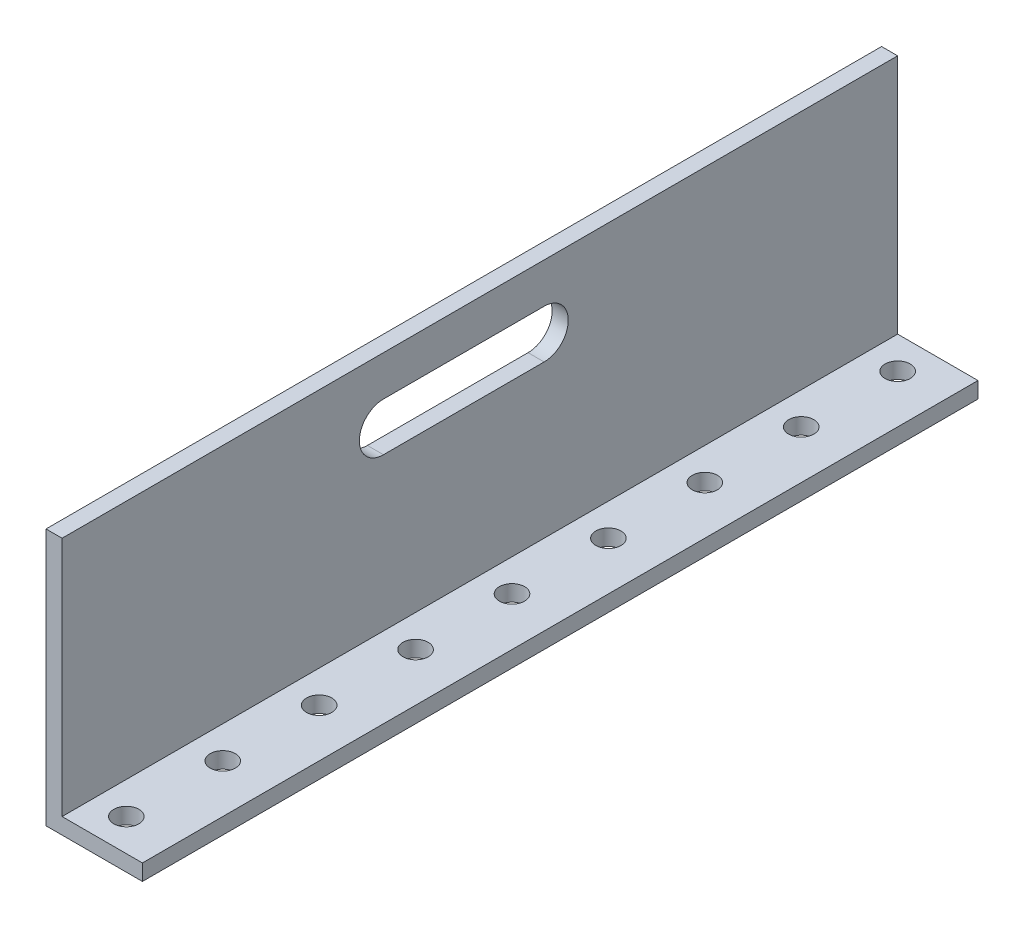
ISO-10303-21;
HEADER;
FILE_DESCRIPTION(('STEP AP214'),'2;1');
FILE_NAME('part.step','',(''),(''),'','','');
FILE_SCHEMA(('AUTOMOTIVE_DESIGN { 1 0 10303 214 1 1 1 1 }'));
ENDSEC;
DATA;
#1=APPLICATION_CONTEXT('core data for automotive mechanical design processes');
#2=APPLICATION_PROTOCOL_DEFINITION('international standard','automotive_design',2000,#1);
#3=PRODUCT_CONTEXT('',#1,'mechanical');
#4=PRODUCT('Part','Part','',(#3));
#5=PRODUCT_RELATED_PRODUCT_CATEGORY('part','',(#4));
#6=PRODUCT_DEFINITION_FORMATION('','',#4);
#7=PRODUCT_DEFINITION_CONTEXT('part definition',#1,'design');
#8=PRODUCT_DEFINITION('design','',#6,#7);
#9=PRODUCT_DEFINITION_SHAPE('','',#8);
#10=(LENGTH_UNIT() NAMED_UNIT(*) SI_UNIT(.MILLI.,.METRE.));
#11=(NAMED_UNIT(*) PLANE_ANGLE_UNIT() SI_UNIT($,.RADIAN.));
#12=(NAMED_UNIT(*) SI_UNIT($,.STERADIAN.) SOLID_ANGLE_UNIT());
#13=UNCERTAINTY_MEASURE_WITH_UNIT(LENGTH_MEASURE(1.E-05),#10,'distance_accuracy_value','');
#14=(GEOMETRIC_REPRESENTATION_CONTEXT(3) GLOBAL_UNCERTAINTY_ASSIGNED_CONTEXT((#13)) GLOBAL_UNIT_ASSIGNED_CONTEXT((#10,
#11,#12)) REPRESENTATION_CONTEXT('',''));
#15=CARTESIAN_POINT('',(0.,0.,0.));
#16=DIRECTION('',(0.,0.,1.));
#17=DIRECTION('',(1.,0.,0.));
#18=AXIS2_PLACEMENT_3D('',#15,#16,#17);
#19=CARTESIAN_POINT('',(0.,0.,165.1));
#20=DIRECTION('',(-1.,0.,0.));
#21=DIRECTION('',(0.,0.,1.));
#22=AXIS2_PLACEMENT_3D('',#19,#20,#21);
#23=PLANE('',#22);
#24=CARTESIAN_POINT('',(0.,38.1,69.85));
#25=DIRECTION('',(-1.,0.,0.));
#26=DIRECTION('',(0.,0.,1.));
#27=AXIS2_PLACEMENT_3D('',#24,#25,#26);
#28=CIRCLE('',#27,4.7625);
#29=CARTESIAN_POINT('',(0.,42.8625,69.85));
#30=VERTEX_POINT('',#29);
#31=CARTESIAN_POINT('',(0.,33.3375,69.85));
#32=VERTEX_POINT('',#31);
#33=EDGE_CURVE('E66',#30,#32,#28,.T.);
#34=ORIENTED_EDGE('',*,*,#33,.F.);
#35=DIRECTION('',(0.,0.,-1.));
#36=VECTOR('',#35,1.);
#37=CARTESIAN_POINT('',(0.,42.8625,69.85));
#38=LINE('',#37,#36);
#39=CARTESIAN_POINT('',(0.,42.8625,101.6));
#40=VERTEX_POINT('',#39);
#41=EDGE_CURVE('E148',#40,#30,#38,.T.);
#42=ORIENTED_EDGE('',*,*,#41,.F.);
#43=CARTESIAN_POINT('',(0.,38.1,101.6));
#44=DIRECTION('',(-1.,0.,0.));
#45=DIRECTION('',(0.,0.,1.));
#46=AXIS2_PLACEMENT_3D('',#43,#44,#45);
#47=CIRCLE('',#46,4.7625);
#48=CARTESIAN_POINT('',(0.,33.3375,101.6));
#49=VERTEX_POINT('',#48);
#50=EDGE_CURVE('E131',#49,#40,#47,.T.);
#51=ORIENTED_EDGE('',*,*,#50,.F.);
#52=DIRECTION('',(0.,0.,1.));
#53=VECTOR('',#52,1.);
#54=CARTESIAN_POINT('',(0.,33.3375,69.85));
#55=LINE('',#54,#53);
#56=EDGE_CURVE('E141',#32,#49,#55,.T.);
#57=ORIENTED_EDGE('',*,*,#56,.F.);
#58=EDGE_LOOP('',(#34,#42,#51,#57));
#59=FACE_BOUND('',#58,.T.);
#60=DIRECTION('',(0.,1.,0.));
#61=VECTOR('',#60,1.);
#62=CARTESIAN_POINT('',(0.,0.,0.));
#63=LINE('',#62,#61);
#64=CARTESIAN_POINT('',(0.,0.,0.));
#65=VERTEX_POINT('',#64);
#66=CARTESIAN_POINT('',(0.,50.8,0.));
#67=VERTEX_POINT('',#66);
#68=EDGE_CURVE('E236',#65,#67,#63,.T.);
#69=ORIENTED_EDGE('',*,*,#68,.F.);
#70=DIRECTION('',(0.,0.,-1.));
#71=VECTOR('',#70,1.);
#72=CARTESIAN_POINT('',(0.,0.,165.1));
#73=LINE('',#72,#71);
#74=CARTESIAN_POINT('',(0.,0.,165.1));
#75=VERTEX_POINT('',#74);
#76=EDGE_CURVE('E296',#75,#65,#73,.T.);
#77=ORIENTED_EDGE('',*,*,#76,.F.);
#78=DIRECTION('',(0.,1.,0.));
#79=VECTOR('',#78,1.);
#80=CARTESIAN_POINT('',(0.,0.,165.1));
#81=LINE('',#80,#79);
#82=CARTESIAN_POINT('',(0.,50.8,165.1));
#83=VERTEX_POINT('',#82);
#84=EDGE_CURVE('E237',#75,#83,#81,.T.);
#85=ORIENTED_EDGE('',*,*,#84,.T.);
#86=DIRECTION('',(0.,0.,-1.));
#87=VECTOR('',#86,1.);
#88=CARTESIAN_POINT('',(0.,50.8,165.1));
#89=LINE('',#88,#87);
#90=EDGE_CURVE('E259',#83,#67,#89,.T.);
#91=ORIENTED_EDGE('',*,*,#90,.T.);
#92=EDGE_LOOP('',(#69,#77,#85,#91));
#93=FACE_BOUND('',#92,.T.);
#94=ADVANCED_FACE('F51',(#59,#93),#23,.T.);
#95=CARTESIAN_POINT('',(0.,0.,165.1));
#96=DIRECTION('',(0.,1.,0.));
#97=DIRECTION('',(0.,0.,1.));
#98=AXIS2_PLACEMENT_3D('',#95,#96,#97);
#99=PLANE('',#98);
#100=CARTESIAN_POINT('',(9.525,0.,6.34999999999999));
#101=DIRECTION('',(0.,1.,0.));
#102=DIRECTION('',(0.,0.,1.));
#103=AXIS2_PLACEMENT_3D('',#100,#101,#102);
#104=CIRCLE('',#103,2.4892);
#105=CARTESIAN_POINT('',(9.525,0.,8.83919999999999));
#106=VERTEX_POINT('',#105);
#107=EDGE_CURVE('E232',#106,#106,#104,.T.);
#108=ORIENTED_EDGE('',*,*,#107,.T.);
#109=EDGE_LOOP('',(#108));
#110=FACE_BOUND('',#109,.T.);
#111=CARTESIAN_POINT('',(9.525,0.,25.4));
#112=DIRECTION('',(0.,1.,0.));
#113=DIRECTION('',(0.,0.,1.));
#114=AXIS2_PLACEMENT_3D('',#111,#112,#113);
#115=CIRCLE('',#114,2.4892);
#116=CARTESIAN_POINT('',(9.525,0.,27.8892));
#117=VERTEX_POINT('',#116);
#118=EDGE_CURVE('E228',#117,#117,#115,.T.);
#119=ORIENTED_EDGE('',*,*,#118,.T.);
#120=EDGE_LOOP('',(#119));
#121=FACE_BOUND('',#120,.T.);
#122=CARTESIAN_POINT('',(9.525,0.,44.45));
#123=DIRECTION('',(0.,1.,0.));
#124=DIRECTION('',(0.,0.,1.));
#125=AXIS2_PLACEMENT_3D('',#122,#123,#124);
#126=CIRCLE('',#125,2.4892);
#127=CARTESIAN_POINT('',(9.525,0.,46.9392));
#128=VERTEX_POINT('',#127);
#129=EDGE_CURVE('E224',#128,#128,#126,.T.);
#130=ORIENTED_EDGE('',*,*,#129,.T.);
#131=EDGE_LOOP('',(#130));
#132=FACE_BOUND('',#131,.T.);
#133=CARTESIAN_POINT('',(9.525,0.,63.5));
#134=DIRECTION('',(0.,1.,0.));
#135=DIRECTION('',(0.,0.,1.));
#136=AXIS2_PLACEMENT_3D('',#133,#134,#135);
#137=CIRCLE('',#136,2.4892);
#138=CARTESIAN_POINT('',(9.525,0.,65.9892));
#139=VERTEX_POINT('',#138);
#140=EDGE_CURVE('E220',#139,#139,#137,.T.);
#141=ORIENTED_EDGE('',*,*,#140,.T.);
#142=EDGE_LOOP('',(#141));
#143=FACE_BOUND('',#142,.T.);
#144=CARTESIAN_POINT('',(9.525,0.,82.55));
#145=DIRECTION('',(0.,1.,0.));
#146=DIRECTION('',(0.,0.,1.));
#147=AXIS2_PLACEMENT_3D('',#144,#145,#146);
#148=CIRCLE('',#147,2.4892);
#149=CARTESIAN_POINT('',(9.525,0.,85.0392));
#150=VERTEX_POINT('',#149);
#151=EDGE_CURVE('E216',#150,#150,#148,.T.);
#152=ORIENTED_EDGE('',*,*,#151,.T.);
#153=EDGE_LOOP('',(#152));
#154=FACE_BOUND('',#153,.T.);
#155=CARTESIAN_POINT('',(9.525,0.,101.6));
#156=DIRECTION('',(0.,1.,0.));
#157=DIRECTION('',(0.,0.,1.));
#158=AXIS2_PLACEMENT_3D('',#155,#156,#157);
#159=CIRCLE('',#158,2.4892);
#160=CARTESIAN_POINT('',(9.525,0.,104.0892));
#161=VERTEX_POINT('',#160);
#162=EDGE_CURVE('E212',#161,#161,#159,.T.);
#163=ORIENTED_EDGE('',*,*,#162,.T.);
#164=EDGE_LOOP('',(#163));
#165=FACE_BOUND('',#164,.T.);
#166=CARTESIAN_POINT('',(9.525,0.,120.65));
#167=DIRECTION('',(0.,1.,0.));
#168=DIRECTION('',(0.,0.,1.));
#169=AXIS2_PLACEMENT_3D('',#166,#167,#168);
#170=CIRCLE('',#169,2.4892);
#171=CARTESIAN_POINT('',(9.525,0.,123.1392));
#172=VERTEX_POINT('',#171);
#173=EDGE_CURVE('E208',#172,#172,#170,.T.);
#174=ORIENTED_EDGE('',*,*,#173,.T.);
#175=EDGE_LOOP('',(#174));
#176=FACE_BOUND('',#175,.T.);
#177=CARTESIAN_POINT('',(9.525,0.,139.7));
#178=DIRECTION('',(0.,1.,0.));
#179=DIRECTION('',(0.,0.,1.));
#180=AXIS2_PLACEMENT_3D('',#177,#178,#179);
#181=CIRCLE('',#180,2.4892);
#182=CARTESIAN_POINT('',(9.525,0.,142.1892));
#183=VERTEX_POINT('',#182);
#184=EDGE_CURVE('E204',#183,#183,#181,.T.);
#185=ORIENTED_EDGE('',*,*,#184,.T.);
#186=EDGE_LOOP('',(#185));
#187=FACE_BOUND('',#186,.T.);
#188=CARTESIAN_POINT('',(9.525,0.,158.75));
#189=DIRECTION('',(0.,1.,0.));
#190=DIRECTION('',(0.,0.,1.));
#191=AXIS2_PLACEMENT_3D('',#188,#189,#190);
#192=CIRCLE('',#191,2.4892);
#193=CARTESIAN_POINT('',(9.525,0.,161.2392));
#194=VERTEX_POINT('',#193);
#195=EDGE_CURVE('E169',#194,#194,#192,.T.);
#196=ORIENTED_EDGE('',*,*,#195,.T.);
#197=EDGE_LOOP('',(#196));
#198=FACE_BOUND('',#197,.T.);
#199=DIRECTION('',(1.,0.,0.));
#200=VECTOR('',#199,1.);
#201=CARTESIAN_POINT('',(0.,0.,0.));
#202=LINE('',#201,#200);
#203=CARTESIAN_POINT('',(19.05,0.,0.));
#204=VERTEX_POINT('',#203);
#205=EDGE_CURVE('E263',#65,#204,#202,.T.);
#206=ORIENTED_EDGE('',*,*,#205,.T.);
#207=DIRECTION('',(0.,0.,-1.));
#208=VECTOR('',#207,1.);
#209=CARTESIAN_POINT('',(19.05,0.,165.1));
#210=LINE('',#209,#208);
#211=CARTESIAN_POINT('',(19.05,0.,165.1));
#212=VERTEX_POINT('',#211);
#213=EDGE_CURVE('E292',#212,#204,#210,.T.);
#214=ORIENTED_EDGE('',*,*,#213,.F.);
#215=DIRECTION('',(1.,0.,0.));
#216=VECTOR('',#215,1.);
#217=CARTESIAN_POINT('',(0.,0.,165.1));
#218=LINE('',#217,#216);
#219=EDGE_CURVE('E241',#75,#212,#218,.T.);
#220=ORIENTED_EDGE('',*,*,#219,.F.);
#221=ORIENTED_EDGE('',*,*,#76,.T.);
#222=EDGE_LOOP('',(#206,#214,#220,#221));
#223=FACE_BOUND('',#222,.T.);
#224=ADVANCED_FACE('F328',(#110,#121,#132,#143,#154,#165,#176,#187,#198,#223),#99,.F.);
#225=CARTESIAN_POINT('',(19.05,0.,165.1));
#226=DIRECTION('',(-1.,0.,0.));
#227=DIRECTION('',(0.,0.,1.));
#228=AXIS2_PLACEMENT_3D('',#225,#226,#227);
#229=PLANE('',#228);
#230=DIRECTION('',(0.,1.,0.));
#231=VECTOR('',#230,1.);
#232=CARTESIAN_POINT('',(19.05,0.,0.));
#233=LINE('',#232,#231);
#234=CARTESIAN_POINT('',(19.05,3.175,0.));
#235=VERTEX_POINT('',#234);
#236=EDGE_CURVE('E266',#204,#235,#233,.T.);
#237=ORIENTED_EDGE('',*,*,#236,.T.);
#238=DIRECTION('',(0.,0.,-1.));
#239=VECTOR('',#238,1.);
#240=CARTESIAN_POINT('',(19.05,3.175,165.1));
#241=LINE('',#240,#239);
#242=CARTESIAN_POINT('',(19.05,3.175,165.1));
#243=VERTEX_POINT('',#242);
#244=EDGE_CURVE('E289',#243,#235,#241,.T.);
#245=ORIENTED_EDGE('',*,*,#244,.F.);
#246=DIRECTION('',(0.,1.,0.));
#247=VECTOR('',#246,1.);
#248=CARTESIAN_POINT('',(19.05,0.,165.1));
#249=LINE('',#248,#247);
#250=EDGE_CURVE('E245',#212,#243,#249,.T.);
#251=ORIENTED_EDGE('',*,*,#250,.F.);
#252=ORIENTED_EDGE('',*,*,#213,.T.);
#253=EDGE_LOOP('',(#237,#245,#251,#252));
#254=FACE_BOUND('',#253,.T.);
#255=ADVANCED_FACE('F332',(#254),#229,.F.);
#256=CARTESIAN_POINT('',(0.,3.175,165.1));
#257=DIRECTION('',(0.,1.,0.));
#258=DIRECTION('',(0.,0.,1.));
#259=AXIS2_PLACEMENT_3D('',#256,#257,#258);
#260=PLANE('',#259);
#261=CARTESIAN_POINT('',(9.525,3.175,6.34999999999999));
#262=DIRECTION('',(0.,1.,0.));
#263=DIRECTION('',(0.,0.,1.));
#264=AXIS2_PLACEMENT_3D('',#261,#262,#263);
#265=CIRCLE('',#264,2.4892);
#266=CARTESIAN_POINT('',(9.525,3.175,8.83919999999999));
#267=VERTEX_POINT('',#266);
#268=EDGE_CURVE('E165',#267,#267,#265,.T.);
#269=ORIENTED_EDGE('',*,*,#268,.F.);
#270=EDGE_LOOP('',(#269));
#271=FACE_BOUND('',#270,.T.);
#272=CARTESIAN_POINT('',(9.525,3.175,25.4));
#273=DIRECTION('',(0.,1.,0.));
#274=DIRECTION('',(0.,0.,1.));
#275=AXIS2_PLACEMENT_3D('',#272,#273,#274);
#276=CIRCLE('',#275,2.4892);
#277=CARTESIAN_POINT('',(9.525,3.175,27.8892));
#278=VERTEX_POINT('',#277);
#279=EDGE_CURVE('E170',#278,#278,#276,.T.);
#280=ORIENTED_EDGE('',*,*,#279,.F.);
#281=EDGE_LOOP('',(#280));
#282=FACE_BOUND('',#281,.T.);
#283=CARTESIAN_POINT('',(9.525,3.175,44.45));
#284=DIRECTION('',(0.,1.,0.));
#285=DIRECTION('',(0.,0.,1.));
#286=AXIS2_PLACEMENT_3D('',#283,#284,#285);
#287=CIRCLE('',#286,2.4892);
#288=CARTESIAN_POINT('',(9.525,3.175,46.9392));
#289=VERTEX_POINT('',#288);
#290=EDGE_CURVE('E174',#289,#289,#287,.T.);
#291=ORIENTED_EDGE('',*,*,#290,.F.);
#292=EDGE_LOOP('',(#291));
#293=FACE_BOUND('',#292,.T.);
#294=CARTESIAN_POINT('',(9.525,3.175,63.5));
#295=DIRECTION('',(0.,1.,0.));
#296=DIRECTION('',(0.,0.,1.));
#297=AXIS2_PLACEMENT_3D('',#294,#295,#296);
#298=CIRCLE('',#297,2.4892);
#299=CARTESIAN_POINT('',(9.525,3.175,65.9892));
#300=VERTEX_POINT('',#299);
#301=EDGE_CURVE('E178',#300,#300,#298,.T.);
#302=ORIENTED_EDGE('',*,*,#301,.F.);
#303=EDGE_LOOP('',(#302));
#304=FACE_BOUND('',#303,.T.);
#305=CARTESIAN_POINT('',(9.525,3.175,82.55));
#306=DIRECTION('',(0.,1.,0.));
#307=DIRECTION('',(0.,0.,1.));
#308=AXIS2_PLACEMENT_3D('',#305,#306,#307);
#309=CIRCLE('',#308,2.4892);
#310=CARTESIAN_POINT('',(9.525,3.175,85.0392));
#311=VERTEX_POINT('',#310);
#312=EDGE_CURVE('E182',#311,#311,#309,.T.);
#313=ORIENTED_EDGE('',*,*,#312,.F.);
#314=EDGE_LOOP('',(#313));
#315=FACE_BOUND('',#314,.T.);
#316=CARTESIAN_POINT('',(9.525,3.175,101.6));
#317=DIRECTION('',(0.,1.,0.));
#318=DIRECTION('',(0.,0.,1.));
#319=AXIS2_PLACEMENT_3D('',#316,#317,#318);
#320=CIRCLE('',#319,2.4892);
#321=CARTESIAN_POINT('',(9.525,3.175,104.0892));
#322=VERTEX_POINT('',#321);
#323=EDGE_CURVE('E186',#322,#322,#320,.T.);
#324=ORIENTED_EDGE('',*,*,#323,.F.);
#325=EDGE_LOOP('',(#324));
#326=FACE_BOUND('',#325,.T.);
#327=CARTESIAN_POINT('',(9.525,3.175,120.65));
#328=DIRECTION('',(0.,1.,0.));
#329=DIRECTION('',(0.,0.,1.));
#330=AXIS2_PLACEMENT_3D('',#327,#328,#329);
#331=CIRCLE('',#330,2.4892);
#332=CARTESIAN_POINT('',(9.525,3.175,123.1392));
#333=VERTEX_POINT('',#332);
#334=EDGE_CURVE('E190',#333,#333,#331,.T.);
#335=ORIENTED_EDGE('',*,*,#334,.F.);
#336=EDGE_LOOP('',(#335));
#337=FACE_BOUND('',#336,.T.);
#338=CARTESIAN_POINT('',(9.525,3.175,139.7));
#339=DIRECTION('',(0.,1.,0.));
#340=DIRECTION('',(0.,0.,1.));
#341=AXIS2_PLACEMENT_3D('',#338,#339,#340);
#342=CIRCLE('',#341,2.4892);
#343=CARTESIAN_POINT('',(9.525,3.175,142.1892));
#344=VERTEX_POINT('',#343);
#345=EDGE_CURVE('E194',#344,#344,#342,.T.);
#346=ORIENTED_EDGE('',*,*,#345,.F.);
#347=EDGE_LOOP('',(#346));
#348=FACE_BOUND('',#347,.T.);
#349=CARTESIAN_POINT('',(9.525,3.175,158.75));
#350=DIRECTION('',(0.,1.,0.));
#351=DIRECTION('',(0.,0.,1.));
#352=AXIS2_PLACEMENT_3D('',#349,#350,#351);
#353=CIRCLE('',#352,2.4892);
#354=CARTESIAN_POINT('',(9.525,3.175,161.2392));
#355=VERTEX_POINT('',#354);
#356=EDGE_CURVE('E160',#355,#355,#353,.T.);
#357=ORIENTED_EDGE('',*,*,#356,.F.);
#358=EDGE_LOOP('',(#357));
#359=FACE_BOUND('',#358,.T.);
#360=DIRECTION('',(1.,0.,0.));
#361=VECTOR('',#360,1.);
#362=CARTESIAN_POINT('',(0.,3.175,0.));
#363=LINE('',#362,#361);
#364=CARTESIAN_POINT('',(3.175,3.175,0.));
#365=VERTEX_POINT('',#364);
#366=EDGE_CURVE('E270',#365,#235,#363,.T.);
#367=ORIENTED_EDGE('',*,*,#366,.F.);
#368=DIRECTION('',(0.,0.,-1.));
#369=VECTOR('',#368,1.);
#370=CARTESIAN_POINT('',(3.175,3.175,165.1));
#371=LINE('',#370,#369);
#372=CARTESIAN_POINT('',(3.175,3.175,165.1));
#373=VERTEX_POINT('',#372);
#374=EDGE_CURVE('E286',#373,#365,#371,.T.);
#375=ORIENTED_EDGE('',*,*,#374,.F.);
#376=DIRECTION('',(1.,0.,0.));
#377=VECTOR('',#376,1.);
#378=CARTESIAN_POINT('',(0.,3.175,165.1));
#379=LINE('',#378,#377);
#380=EDGE_CURVE('E248',#373,#243,#379,.T.);
#381=ORIENTED_EDGE('',*,*,#380,.T.);
#382=ORIENTED_EDGE('',*,*,#244,.T.);
#383=EDGE_LOOP('',(#367,#375,#381,#382));
#384=FACE_BOUND('',#383,.T.);
#385=ADVANCED_FACE('F339',(#271,#282,#293,#304,#315,#326,#337,#348,#359,#384),#260,.T.);
#386=CARTESIAN_POINT('',(3.175,0.,165.1));
#387=DIRECTION('',(-1.,0.,0.));
#388=DIRECTION('',(0.,0.,1.));
#389=AXIS2_PLACEMENT_3D('',#386,#387,#388);
#390=PLANE('',#389);
#391=DIRECTION('',(0.,0.,-1.));
#392=VECTOR('',#391,1.);
#393=CARTESIAN_POINT('',(3.175,42.8625,165.1));
#394=LINE('',#393,#392);
#395=CARTESIAN_POINT('',(3.17500000000001,42.8625,101.6));
#396=VERTEX_POINT('',#395);
#397=CARTESIAN_POINT('',(3.17500000000001,42.8625,69.85));
#398=VERTEX_POINT('',#397);
#399=EDGE_CURVE('E59',#396,#398,#394,.T.);
#400=ORIENTED_EDGE('',*,*,#399,.T.);
#401=CARTESIAN_POINT('',(3.17500000000001,38.1,69.85));
#402=DIRECTION('',(-1.,0.,0.));
#403=DIRECTION('',(0.,0.,1.));
#404=AXIS2_PLACEMENT_3D('',#401,#402,#403);
#405=CIRCLE('',#404,4.7625);
#406=CARTESIAN_POINT('',(3.17500000000001,33.3375,69.85));
#407=VERTEX_POINT('',#406);
#408=EDGE_CURVE('E11',#398,#407,#405,.T.);
#409=ORIENTED_EDGE('',*,*,#408,.T.);
#410=DIRECTION('',(0.,0.,1.));
#411=VECTOR('',#410,1.);
#412=CARTESIAN_POINT('',(3.175,33.3375,165.1));
#413=LINE('',#412,#411);
#414=CARTESIAN_POINT('',(3.175,33.3375,101.6));
#415=VERTEX_POINT('',#414);
#416=EDGE_CURVE('E299',#407,#415,#413,.T.);
#417=ORIENTED_EDGE('',*,*,#416,.T.);
#418=CARTESIAN_POINT('',(3.17500000000001,38.1,101.6));
#419=DIRECTION('',(-1.,0.,0.));
#420=DIRECTION('',(0.,0.,1.));
#421=AXIS2_PLACEMENT_3D('',#418,#419,#420);
#422=CIRCLE('',#421,4.7625);
#423=EDGE_CURVE('E134',#415,#396,#422,.T.);
#424=ORIENTED_EDGE('',*,*,#423,.T.);
#425=EDGE_LOOP('',(#400,#409,#417,#424));
#426=FACE_BOUND('',#425,.T.);
#427=DIRECTION('',(0.,1.,0.));
#428=VECTOR('',#427,1.);
#429=CARTESIAN_POINT('',(3.175,0.,0.));
#430=LINE('',#429,#428);
#431=CARTESIAN_POINT('',(3.175,50.8,0.));
#432=VERTEX_POINT('',#431);
#433=EDGE_CURVE('E274',#365,#432,#430,.T.);
#434=ORIENTED_EDGE('',*,*,#433,.T.);
#435=DIRECTION('',(0.,0.,-1.));
#436=VECTOR('',#435,1.);
#437=CARTESIAN_POINT('',(3.175,50.8,165.1));
#438=LINE('',#437,#436);
#439=CARTESIAN_POINT('',(3.175,50.8,165.1));
#440=VERTEX_POINT('',#439);
#441=EDGE_CURVE('E283',#440,#432,#438,.T.);
#442=ORIENTED_EDGE('',*,*,#441,.F.);
#443=DIRECTION('',(0.,1.,0.));
#444=VECTOR('',#443,1.);
#445=CARTESIAN_POINT('',(3.175,0.,165.1));
#446=LINE('',#445,#444);
#447=EDGE_CURVE('E252',#373,#440,#446,.T.);
#448=ORIENTED_EDGE('',*,*,#447,.F.);
#449=ORIENTED_EDGE('',*,*,#374,.T.);
#450=EDGE_LOOP('',(#434,#442,#448,#449));
#451=FACE_BOUND('',#450,.T.);
#452=ADVANCED_FACE('F308',(#426,#451),#390,.F.);
#453=CARTESIAN_POINT('',(0.,50.8,165.1));
#454=DIRECTION('',(0.,1.,0.));
#455=DIRECTION('',(0.,0.,1.));
#456=AXIS2_PLACEMENT_3D('',#453,#454,#455);
#457=PLANE('',#456);
#458=DIRECTION('',(1.,0.,0.));
#459=VECTOR('',#458,1.);
#460=CARTESIAN_POINT('',(0.,50.8,0.));
#461=LINE('',#460,#459);
#462=EDGE_CURVE('E242',#67,#432,#461,.T.);
#463=ORIENTED_EDGE('',*,*,#462,.F.);
#464=ORIENTED_EDGE('',*,*,#90,.F.);
#465=DIRECTION('',(1.,0.,0.));
#466=VECTOR('',#465,1.);
#467=CARTESIAN_POINT('',(0.,50.8,165.1));
#468=LINE('',#467,#466);
#469=EDGE_CURVE('E255',#83,#440,#468,.T.);
#470=ORIENTED_EDGE('',*,*,#469,.T.);
#471=ORIENTED_EDGE('',*,*,#441,.T.);
#472=EDGE_LOOP('',(#463,#464,#470,#471));
#473=FACE_BOUND('',#472,.T.);
#474=ADVANCED_FACE('F347',(#473),#457,.T.);
#475=CARTESIAN_POINT('',(0.,0.,165.1));
#476=DIRECTION('',(0.,0.,1.));
#477=DIRECTION('',(1.,0.,0.));
#478=AXIS2_PLACEMENT_3D('',#475,#476,#477);
#479=PLANE('',#478);
#480=ORIENTED_EDGE('',*,*,#84,.F.);
#481=ORIENTED_EDGE('',*,*,#219,.T.);
#482=ORIENTED_EDGE('',*,*,#250,.T.);
#483=ORIENTED_EDGE('',*,*,#380,.F.);
#484=ORIENTED_EDGE('',*,*,#447,.T.);
#485=ORIENTED_EDGE('',*,*,#469,.F.);
#486=EDGE_LOOP('',(#480,#481,#482,#483,#484,#485));
#487=FACE_BOUND('',#486,.T.);
#488=ADVANCED_FACE('F350',(#487),#479,.T.);
#489=CARTESIAN_POINT('',(0.,0.,0.));
#490=DIRECTION('',(0.,0.,1.));
#491=DIRECTION('',(1.,0.,0.));
#492=AXIS2_PLACEMENT_3D('',#489,#490,#491);
#493=PLANE('',#492);
#494=ORIENTED_EDGE('',*,*,#68,.T.);
#495=ORIENTED_EDGE('',*,*,#462,.T.);
#496=ORIENTED_EDGE('',*,*,#433,.F.);
#497=ORIENTED_EDGE('',*,*,#366,.T.);
#498=ORIENTED_EDGE('',*,*,#236,.F.);
#499=ORIENTED_EDGE('',*,*,#205,.F.);
#500=EDGE_LOOP('',(#494,#495,#496,#497,#498,#499));
#501=FACE_BOUND('',#500,.T.);
#502=ADVANCED_FACE('F352',(#501),#493,.F.);
#503=CARTESIAN_POINT('',(9.525,-161.925,158.75));
#504=DIRECTION('',(0.,1.,0.));
#505=DIRECTION('',(0.,0.,1.));
#506=AXIS2_PLACEMENT_3D('',#503,#504,#505);
#507=CYLINDRICAL_SURFACE('',#506,2.4892);
#508=ORIENTED_EDGE('',*,*,#356,.T.);
#509=EDGE_LOOP('',(#508));
#510=FACE_BOUND('',#509,.T.);
#511=ORIENTED_EDGE('',*,*,#195,.F.);
#512=EDGE_LOOP('',(#511));
#513=FACE_BOUND('',#512,.T.);
#514=ADVANCED_FACE('F354',(#510,#513),#507,.F.);
#515=CARTESIAN_POINT('',(9.525,-161.925,139.7));
#516=DIRECTION('',(0.,1.,0.));
#517=DIRECTION('',(0.,0.,1.));
#518=AXIS2_PLACEMENT_3D('',#515,#516,#517);
#519=CYLINDRICAL_SURFACE('',#518,2.4892);
#520=ORIENTED_EDGE('',*,*,#345,.T.);
#521=EDGE_LOOP('',(#520));
#522=FACE_BOUND('',#521,.T.);
#523=ORIENTED_EDGE('',*,*,#184,.F.);
#524=EDGE_LOOP('',(#523));
#525=FACE_BOUND('',#524,.T.);
#526=ADVANCED_FACE('F361',(#522,#525),#519,.F.);
#527=CARTESIAN_POINT('',(9.525,-161.925,120.65));
#528=DIRECTION('',(0.,1.,0.));
#529=DIRECTION('',(0.,0.,1.));
#530=AXIS2_PLACEMENT_3D('',#527,#528,#529);
#531=CYLINDRICAL_SURFACE('',#530,2.4892);
#532=ORIENTED_EDGE('',*,*,#334,.T.);
#533=EDGE_LOOP('',(#532));
#534=FACE_BOUND('',#533,.T.);
#535=ORIENTED_EDGE('',*,*,#173,.F.);
#536=EDGE_LOOP('',(#535));
#537=FACE_BOUND('',#536,.T.);
#538=ADVANCED_FACE('F365',(#534,#537),#531,.F.);
#539=CARTESIAN_POINT('',(9.525,-161.925,101.6));
#540=DIRECTION('',(0.,1.,0.));
#541=DIRECTION('',(0.,0.,1.));
#542=AXIS2_PLACEMENT_3D('',#539,#540,#541);
#543=CYLINDRICAL_SURFACE('',#542,2.4892);
#544=ORIENTED_EDGE('',*,*,#323,.T.);
#545=EDGE_LOOP('',(#544));
#546=FACE_BOUND('',#545,.T.);
#547=ORIENTED_EDGE('',*,*,#162,.F.);
#548=EDGE_LOOP('',(#547));
#549=FACE_BOUND('',#548,.T.);
#550=ADVANCED_FACE('F369',(#546,#549),#543,.F.);
#551=CARTESIAN_POINT('',(9.525,-161.925,82.55));
#552=DIRECTION('',(0.,1.,0.));
#553=DIRECTION('',(0.,0.,1.));
#554=AXIS2_PLACEMENT_3D('',#551,#552,#553);
#555=CYLINDRICAL_SURFACE('',#554,2.4892);
#556=ORIENTED_EDGE('',*,*,#312,.T.);
#557=EDGE_LOOP('',(#556));
#558=FACE_BOUND('',#557,.T.);
#559=ORIENTED_EDGE('',*,*,#151,.F.);
#560=EDGE_LOOP('',(#559));
#561=FACE_BOUND('',#560,.T.);
#562=ADVANCED_FACE('F373',(#558,#561),#555,.F.);
#563=CARTESIAN_POINT('',(9.525,-161.925,63.5));
#564=DIRECTION('',(0.,1.,0.));
#565=DIRECTION('',(0.,0.,1.));
#566=AXIS2_PLACEMENT_3D('',#563,#564,#565);
#567=CYLINDRICAL_SURFACE('',#566,2.4892);
#568=ORIENTED_EDGE('',*,*,#301,.T.);
#569=EDGE_LOOP('',(#568));
#570=FACE_BOUND('',#569,.T.);
#571=ORIENTED_EDGE('',*,*,#140,.F.);
#572=EDGE_LOOP('',(#571));
#573=FACE_BOUND('',#572,.T.);
#574=ADVANCED_FACE('F377',(#570,#573),#567,.F.);
#575=CARTESIAN_POINT('',(9.525,-161.925,44.45));
#576=DIRECTION('',(0.,1.,0.));
#577=DIRECTION('',(0.,0.,1.));
#578=AXIS2_PLACEMENT_3D('',#575,#576,#577);
#579=CYLINDRICAL_SURFACE('',#578,2.4892);
#580=ORIENTED_EDGE('',*,*,#290,.T.);
#581=EDGE_LOOP('',(#580));
#582=FACE_BOUND('',#581,.T.);
#583=ORIENTED_EDGE('',*,*,#129,.F.);
#584=EDGE_LOOP('',(#583));
#585=FACE_BOUND('',#584,.T.);
#586=ADVANCED_FACE('F381',(#582,#585),#579,.F.);
#587=CARTESIAN_POINT('',(9.525,-161.925,25.4));
#588=DIRECTION('',(0.,1.,0.));
#589=DIRECTION('',(0.,0.,1.));
#590=AXIS2_PLACEMENT_3D('',#587,#588,#589);
#591=CYLINDRICAL_SURFACE('',#590,2.4892);
#592=ORIENTED_EDGE('',*,*,#279,.T.);
#593=EDGE_LOOP('',(#592));
#594=FACE_BOUND('',#593,.T.);
#595=ORIENTED_EDGE('',*,*,#118,.F.);
#596=EDGE_LOOP('',(#595));
#597=FACE_BOUND('',#596,.T.);
#598=ADVANCED_FACE('F323',(#594,#597),#591,.F.);
#599=CARTESIAN_POINT('',(9.525,-161.925,6.34999999999999));
#600=DIRECTION('',(0.,1.,0.));
#601=DIRECTION('',(0.,0.,1.));
#602=AXIS2_PLACEMENT_3D('',#599,#600,#601);
#603=CYLINDRICAL_SURFACE('',#602,2.4892);
#604=ORIENTED_EDGE('',*,*,#268,.T.);
#605=EDGE_LOOP('',(#604));
#606=FACE_BOUND('',#605,.T.);
#607=ORIENTED_EDGE('',*,*,#107,.F.);
#608=EDGE_LOOP('',(#607));
#609=FACE_BOUND('',#608,.T.);
#610=ADVANCED_FACE('F315',(#606,#609),#603,.F.);
#611=CARTESIAN_POINT('',(165.1,38.1,69.85));
#612=DIRECTION('',(-1.,0.,0.));
#613=DIRECTION('',(0.,0.,1.));
#614=AXIS2_PLACEMENT_3D('',#611,#612,#613);
#615=CYLINDRICAL_SURFACE('',#614,4.7625);
#616=DIRECTION('',(-1.,0.,0.));
#617=VECTOR('',#616,1.);
#618=CARTESIAN_POINT('',(165.1,42.8625,69.85));
#619=LINE('',#618,#617);
#620=EDGE_CURVE('E157',#398,#30,#619,.T.);
#621=ORIENTED_EDGE('',*,*,#620,.T.);
#622=ORIENTED_EDGE('',*,*,#33,.T.);
#623=DIRECTION('',(-1.,0.,0.));
#624=VECTOR('',#623,1.);
#625=CARTESIAN_POINT('',(165.1,33.3375,69.85));
#626=LINE('',#625,#624);
#627=EDGE_CURVE('E138',#407,#32,#626,.T.);
#628=ORIENTED_EDGE('',*,*,#627,.F.);
#629=ORIENTED_EDGE('',*,*,#408,.F.);
#630=EDGE_LOOP('',(#621,#622,#628,#629));
#631=FACE_BOUND('',#630,.T.);
#632=ADVANCED_FACE('F313',(#631),#615,.F.);
#633=CARTESIAN_POINT('',(165.1,42.8625,69.85));
#634=DIRECTION('',(0.,1.,0.));
#635=DIRECTION('',(0.,0.,1.));
#636=AXIS2_PLACEMENT_3D('',#633,#634,#635);
#637=PLANE('',#636);
#638=DIRECTION('',(-1.,0.,0.));
#639=VECTOR('',#638,1.);
#640=CARTESIAN_POINT('',(165.1,42.8625,101.6));
#641=LINE('',#640,#639);
#642=EDGE_CURVE('E137',#396,#40,#641,.T.);
#643=ORIENTED_EDGE('',*,*,#642,.T.);
#644=ORIENTED_EDGE('',*,*,#41,.T.);
#645=ORIENTED_EDGE('',*,*,#620,.F.);
#646=ORIENTED_EDGE('',*,*,#399,.F.);
#647=EDGE_LOOP('',(#643,#644,#645,#646));
#648=FACE_BOUND('',#647,.T.);
#649=ADVANCED_FACE('F312',(#648),#637,.F.);
#650=CARTESIAN_POINT('',(165.1,38.1,101.6));
#651=DIRECTION('',(-1.,0.,0.));
#652=DIRECTION('',(0.,0.,1.));
#653=AXIS2_PLACEMENT_3D('',#650,#651,#652);
#654=CYLINDRICAL_SURFACE('',#653,4.7625);
#655=DIRECTION('',(-1.,0.,0.));
#656=VECTOR('',#655,1.);
#657=CARTESIAN_POINT('',(165.1,33.3375,101.6));
#658=LINE('',#657,#656);
#659=EDGE_CURVE('E74',#415,#49,#658,.T.);
#660=ORIENTED_EDGE('',*,*,#659,.T.);
#661=ORIENTED_EDGE('',*,*,#50,.T.);
#662=ORIENTED_EDGE('',*,*,#642,.F.);
#663=ORIENTED_EDGE('',*,*,#423,.F.);
#664=EDGE_LOOP('',(#660,#661,#662,#663));
#665=FACE_BOUND('',#664,.T.);
#666=ADVANCED_FACE('F128',(#665),#654,.F.);
#667=CARTESIAN_POINT('',(165.1,33.3375,69.85));
#668=DIRECTION('',(0.,-1.,0.));
#669=DIRECTION('',(0.,0.,-1.));
#670=AXIS2_PLACEMENT_3D('',#667,#668,#669);
#671=PLANE('',#670);
#672=ORIENTED_EDGE('',*,*,#627,.T.);
#673=ORIENTED_EDGE('',*,*,#56,.T.);
#674=ORIENTED_EDGE('',*,*,#659,.F.);
#675=ORIENTED_EDGE('',*,*,#416,.F.);
#676=EDGE_LOOP('',(#672,#673,#674,#675));
#677=FACE_BOUND('',#676,.T.);
#678=ADVANCED_FACE('F142',(#677),#671,.F.);
#679=CLOSED_SHELL('',(#94,#224,#255,#385,#452,#474,#488,#502,#514,#526,#538,#550,#562,#574,#586,
#598,#610,#632,#649,#666,#678));
#680=MANIFOLD_SOLID_BREP('B2',#679);
#681=ADVANCED_BREP_SHAPE_REPRESENTATION('',(#18,#680),#14);
#682=SHAPE_DEFINITION_REPRESENTATION(#9,#681);
ENDSEC;
END-ISO-10303-21;
